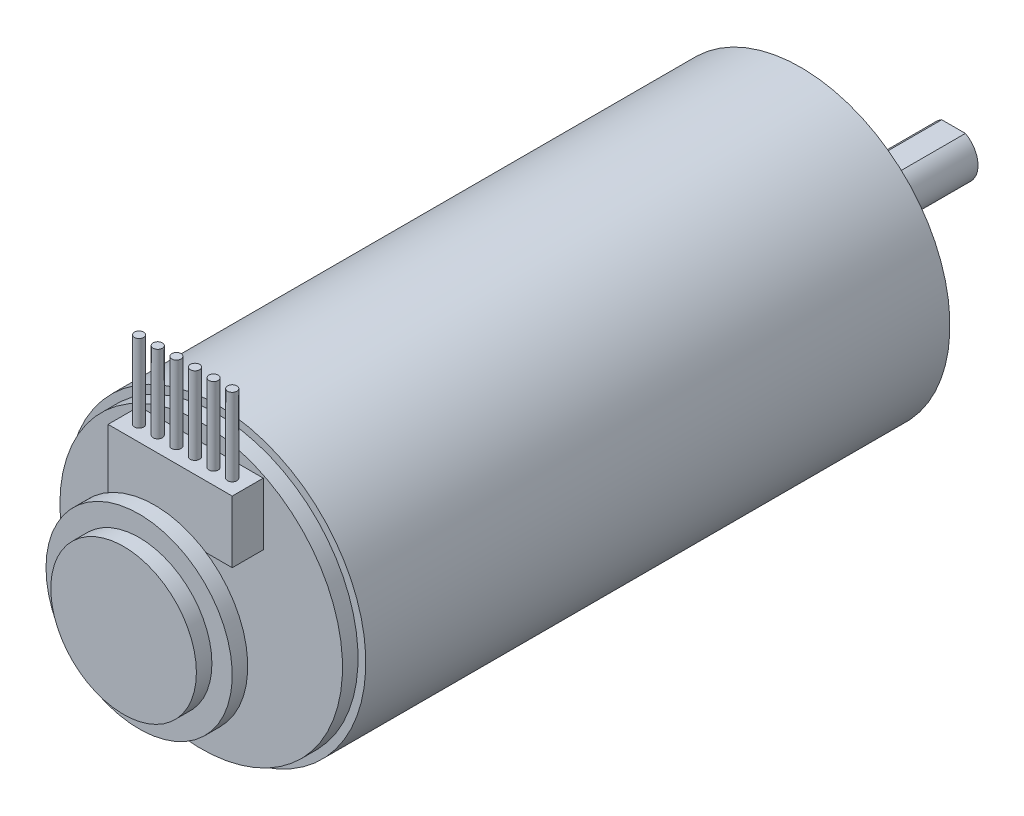
ISO-10303-21;
HEADER;
FILE_DESCRIPTION(('STEP AP214'),'2;1');
FILE_NAME('part.step','',(''),(''),'','','');
FILE_SCHEMA(('AUTOMOTIVE_DESIGN { 1 0 10303 214 1 1 1 1 }'));
ENDSEC;
DATA;
#1=APPLICATION_CONTEXT('core data for automotive mechanical design processes');
#2=APPLICATION_PROTOCOL_DEFINITION('international standard','automotive_design',2000,#1);
#3=PRODUCT_CONTEXT('',#1,'mechanical');
#4=PRODUCT('Part','Part','',(#3));
#5=PRODUCT_RELATED_PRODUCT_CATEGORY('part','',(#4));
#6=PRODUCT_DEFINITION_FORMATION('','',#4);
#7=PRODUCT_DEFINITION_CONTEXT('part definition',#1,'design');
#8=PRODUCT_DEFINITION('design','',#6,#7);
#9=PRODUCT_DEFINITION_SHAPE('','',#8);
#10=(LENGTH_UNIT() NAMED_UNIT(*) SI_UNIT(.MILLI.,.METRE.));
#11=(NAMED_UNIT(*) PLANE_ANGLE_UNIT() SI_UNIT($,.RADIAN.));
#12=(NAMED_UNIT(*) SI_UNIT($,.STERADIAN.) SOLID_ANGLE_UNIT());
#13=UNCERTAINTY_MEASURE_WITH_UNIT(LENGTH_MEASURE(1.E-05),#10,'distance_accuracy_value','');
#14=(GEOMETRIC_REPRESENTATION_CONTEXT(3) GLOBAL_UNCERTAINTY_ASSIGNED_CONTEXT((#13)) GLOBAL_UNIT_ASSIGNED_CONTEXT((#10,
#11,#12)) REPRESENTATION_CONTEXT('',''));
#15=CARTESIAN_POINT('',(0.,0.,0.));
#16=DIRECTION('',(0.,0.,1.));
#17=DIRECTION('',(1.,0.,0.));
#18=AXIS2_PLACEMENT_3D('',#15,#16,#17);
#19=CARTESIAN_POINT('',(11.5650000094,0.,61.5699999992));
#20=DIRECTION('',(0.,0.,1.));
#21=DIRECTION('',(1.,0.,0.));
#22=AXIS2_PLACEMENT_3D('',#19,#20,#21);
#23=PLANE('',#22);
#24=CARTESIAN_POINT('',(0.,0.,61.5699999992));
#25=DIRECTION('',(0.,0.,-1.));
#26=DIRECTION('',(-1.,0.,0.));
#27=AXIS2_PLACEMENT_3D('',#24,#25,#26);
#28=CIRCLE('',#27,1.27);
#29=CARTESIAN_POINT('',(-1.27,0.,61.5699999992));
#30=VERTEX_POINT('',#29);
#31=EDGE_CURVE('E151',#30,#30,#28,.T.);
#32=ORIENTED_EDGE('',*,*,#31,.T.);
#33=EDGE_LOOP('',(#32));
#34=FACE_BOUND('',#33,.T.);
#35=CARTESIAN_POINT('',(0.,0.,61.5699999992));
#36=DIRECTION('',(0.,0.,-1.));
#37=DIRECTION('',(-1.,0.,0.));
#38=AXIS2_PLACEMENT_3D('',#35,#36,#37);
#39=CIRCLE('',#38,11.5650000094);
#40=CARTESIAN_POINT('',(-11.5650000094,0.,61.5699999992));
#41=VERTEX_POINT('',#40);
#42=EDGE_CURVE('E154',#41,#41,#39,.T.);
#43=ORIENTED_EDGE('',*,*,#42,.F.);
#44=EDGE_LOOP('',(#43));
#45=FACE_BOUND('',#44,.T.);
#46=DIRECTION('',(-1.,0.,0.));
#47=VECTOR('',#46,1.);
#48=CARTESIAN_POINT('',(-5.08000000144073,10.1599999970296,61.5699999992));
#49=LINE('',#48,#47);
#50=CARTESIAN_POINT('',(5.08000000144073,10.1599999970296,61.5699999992));
#51=VERTEX_POINT('',#50);
#52=CARTESIAN_POINT('',(-5.08000000144073,10.1599999970296,61.5699999992));
#53=VERTEX_POINT('',#52);
#54=EDGE_CURVE('E494',#51,#53,#49,.T.);
#55=ORIENTED_EDGE('',*,*,#54,.F.);
#56=DIRECTION('',(0.,1.,0.));
#57=VECTOR('',#56,1.);
#58=CARTESIAN_POINT('',(5.08000000144073,10.1599999970296,61.5699999992));
#59=LINE('',#58,#57);
#60=CARTESIAN_POINT('',(5.08000000144073,5.08000000144073,61.5699999992));
#61=VERTEX_POINT('',#60);
#62=EDGE_CURVE('E110',#61,#51,#59,.T.);
#63=ORIENTED_EDGE('',*,*,#62,.F.);
#64=DIRECTION('',(1.,0.,0.));
#65=VECTOR('',#64,1.);
#66=CARTESIAN_POINT('',(5.08000000144073,5.08000000144073,61.5699999992));
#67=LINE('',#66,#65);
#68=CARTESIAN_POINT('',(-5.08000000144073,5.08000000144073,61.5699999992));
#69=VERTEX_POINT('',#68);
#70=EDGE_CURVE('E106',#69,#61,#67,.T.);
#71=ORIENTED_EDGE('',*,*,#70,.F.);
#72=DIRECTION('',(0.,-1.,0.));
#73=VECTOR('',#72,1.);
#74=CARTESIAN_POINT('',(-5.08000000144073,5.08000000144073,61.5699999992));
#75=LINE('',#74,#73);
#76=EDGE_CURVE('E496',#53,#69,#75,.T.);
#77=ORIENTED_EDGE('',*,*,#76,.F.);
#78=EDGE_LOOP('',(#55,#63,#71,#77));
#79=FACE_BOUND('',#78,.T.);
#80=ADVANCED_FACE('F33',(#34,#45,#79),#23,.T.);
#81=CARTESIAN_POINT('',(0.,0.,66.6499999992));
#82=DIRECTION('',(0.,0.,-1.));
#83=DIRECTION('',(-1.,0.,0.));
#84=AXIS2_PLACEMENT_3D('',#81,#82,#83);
#85=CYLINDRICAL_SURFACE('',#84,7.62);
#86=CARTESIAN_POINT('',(0.,0.,66.6499999992));
#87=DIRECTION('',(0.,0.,-1.));
#88=DIRECTION('',(-1.,0.,0.));
#89=AXIS2_PLACEMENT_3D('',#86,#87,#88);
#90=CIRCLE('',#89,7.62);
#91=CARTESIAN_POINT('',(-7.62,0.,66.6499999992));
#92=VERTEX_POINT('',#91);
#93=EDGE_CURVE('E166',#92,#92,#90,.T.);
#94=ORIENTED_EDGE('',*,*,#93,.T.);
#95=EDGE_LOOP('',(#94));
#96=FACE_BOUND('',#95,.T.);
#97=CARTESIAN_POINT('',(0.,0.,65.3799999992));
#98=DIRECTION('',(0.,0.,-1.));
#99=DIRECTION('',(-1.,0.,0.));
#100=AXIS2_PLACEMENT_3D('',#97,#98,#99);
#101=CIRCLE('',#100,7.62);
#102=CARTESIAN_POINT('',(-7.62,0.,65.3799999992));
#103=VERTEX_POINT('',#102);
#104=EDGE_CURVE('E143',#103,#103,#101,.T.);
#105=ORIENTED_EDGE('',*,*,#104,.F.);
#106=EDGE_LOOP('',(#105));
#107=FACE_BOUND('',#106,.T.);
#108=ADVANCED_FACE('F35',(#96,#107),#85,.T.);
#109=CARTESIAN_POINT('',(7.62,0.,66.6499999992));
#110=DIRECTION('',(0.,0.,1.));
#111=DIRECTION('',(1.,0.,0.));
#112=AXIS2_PLACEMENT_3D('',#109,#110,#111);
#113=PLANE('',#112);
#114=CARTESIAN_POINT('',(0.,0.,66.6499999992));
#115=DIRECTION('',(0.,0.,1.));
#116=DIRECTION('',(1.,0.,0.));
#117=AXIS2_PLACEMENT_3D('',#114,#115,#116);
#118=CIRCLE('',#117,5.9577109446);
#119=CARTESIAN_POINT('',(5.9577109446,0.,66.6499999992));
#120=VERTEX_POINT('',#119);
#121=EDGE_CURVE('E112',#120,#120,#118,.T.);
#122=ORIENTED_EDGE('',*,*,#121,.F.);
#123=EDGE_LOOP('',(#122));
#124=FACE_BOUND('',#123,.T.);
#125=ORIENTED_EDGE('',*,*,#93,.F.);
#126=EDGE_LOOP('',(#125));
#127=FACE_BOUND('',#126,.T.);
#128=ADVANCED_FACE('F219',(#124,#127),#113,.T.);
#129=CARTESIAN_POINT('',(0.,0.,12.4999999936));
#130=DIRECTION('',(0.,0.,-1.));
#131=DIRECTION('',(-1.,0.,0.));
#132=AXIS2_PLACEMENT_3D('',#129,#130,#131);
#133=PLANE('',#132);
#134=CARTESIAN_POINT('',(0.,0.,12.4999999936));
#135=DIRECTION('',(0.,0.,-1.));
#136=DIRECTION('',(-1.,0.,0.));
#137=AXIS2_PLACEMENT_3D('',#134,#135,#136);
#138=CIRCLE('',#137,3.5000000104);
#139=CARTESIAN_POINT('',(-3.5000000104,0.,12.4999999936));
#140=VERTEX_POINT('',#139);
#141=EDGE_CURVE('E137',#140,#140,#138,.T.);
#142=ORIENTED_EDGE('',*,*,#141,.F.);
#143=EDGE_LOOP('',(#142));
#144=FACE_BOUND('',#143,.T.);
#145=CARTESIAN_POINT('',(0.,0.,12.4999999936));
#146=DIRECTION('',(0.,0.,-1.));
#147=DIRECTION('',(-1.,0.,0.));
#148=AXIS2_PLACEMENT_3D('',#145,#146,#147);
#149=CIRCLE('',#148,12.2000000094);
#150=CARTESIAN_POINT('',(-12.2000000094,0.,12.4999999936));
#151=VERTEX_POINT('',#150);
#152=EDGE_CURVE('E163',#151,#151,#149,.T.);
#153=ORIENTED_EDGE('',*,*,#152,.T.);
#154=EDGE_LOOP('',(#153));
#155=FACE_BOUND('',#154,.T.);
#156=ADVANCED_FACE('F237',(#144,#155),#133,.T.);
#157=CARTESIAN_POINT('',(0.,0.,66.6499999992));
#158=DIRECTION('',(0.,0.,-1.));
#159=DIRECTION('',(-1.,0.,0.));
#160=AXIS2_PLACEMENT_3D('',#157,#158,#159);
#161=CYLINDRICAL_SURFACE('',#160,12.2000000094);
#162=CARTESIAN_POINT('',(0.,0.,60.2999999992));
#163=DIRECTION('',(0.,0.,-1.));
#164=DIRECTION('',(-1.,0.,0.));
#165=AXIS2_PLACEMENT_3D('',#162,#163,#164);
#166=CIRCLE('',#165,12.2000000094);
#167=CARTESIAN_POINT('',(-12.2000000094,0.,60.2999999992));
#168=VERTEX_POINT('',#167);
#169=EDGE_CURVE('E160',#168,#168,#166,.T.);
#170=ORIENTED_EDGE('',*,*,#169,.T.);
#171=EDGE_LOOP('',(#170));
#172=FACE_BOUND('',#171,.T.);
#173=ORIENTED_EDGE('',*,*,#152,.F.);
#174=EDGE_LOOP('',(#173));
#175=FACE_BOUND('',#174,.T.);
#176=ADVANCED_FACE('F233',(#172,#175),#161,.T.);
#177=CARTESIAN_POINT('',(12.2000000094,0.,60.2999999992));
#178=DIRECTION('',(0.,0.,1.));
#179=DIRECTION('',(1.,0.,0.));
#180=AXIS2_PLACEMENT_3D('',#177,#178,#179);
#181=PLANE('',#180);
#182=CARTESIAN_POINT('',(0.,0.,60.2999999992));
#183=DIRECTION('',(0.,0.,-1.));
#184=DIRECTION('',(-1.,0.,0.));
#185=AXIS2_PLACEMENT_3D('',#182,#183,#184);
#186=CIRCLE('',#185,11.5650000094);
#187=CARTESIAN_POINT('',(-11.5650000094,0.,60.2999999992));
#188=VERTEX_POINT('',#187);
#189=EDGE_CURVE('E157',#188,#188,#186,.T.);
#190=ORIENTED_EDGE('',*,*,#189,.T.);
#191=EDGE_LOOP('',(#190));
#192=FACE_BOUND('',#191,.T.);
#193=ORIENTED_EDGE('',*,*,#169,.F.);
#194=EDGE_LOOP('',(#193));
#195=FACE_BOUND('',#194,.T.);
#196=ADVANCED_FACE('F229',(#192,#195),#181,.T.);
#197=CARTESIAN_POINT('',(0.,0.,66.6499999992));
#198=DIRECTION('',(0.,0.,-1.));
#199=DIRECTION('',(-1.,0.,0.));
#200=AXIS2_PLACEMENT_3D('',#197,#198,#199);
#201=CYLINDRICAL_SURFACE('',#200,11.5650000094);
#202=ORIENTED_EDGE('',*,*,#42,.T.);
#203=EDGE_LOOP('',(#202));
#204=FACE_BOUND('',#203,.T.);
#205=ORIENTED_EDGE('',*,*,#189,.F.);
#206=EDGE_LOOP('',(#205));
#207=FACE_BOUND('',#206,.T.);
#208=ADVANCED_FACE('F226',(#204,#207),#201,.T.);
#209=CARTESIAN_POINT('',(0.,0.,66.6499999992));
#210=DIRECTION('',(0.,0.,-1.));
#211=DIRECTION('',(-1.,0.,0.));
#212=AXIS2_PLACEMENT_3D('',#209,#210,#211);
#213=CYLINDRICAL_SURFACE('',#212,1.27);
#214=CARTESIAN_POINT('',(0.,0.,65.3799999992));
#215=DIRECTION('',(0.,0.,-1.));
#216=DIRECTION('',(-1.,0.,0.));
#217=AXIS2_PLACEMENT_3D('',#214,#215,#216);
#218=CIRCLE('',#217,1.27);
#219=CARTESIAN_POINT('',(-1.27,0.,65.3799999992));
#220=VERTEX_POINT('',#219);
#221=EDGE_CURVE('E148',#220,#220,#218,.T.);
#222=ORIENTED_EDGE('',*,*,#221,.T.);
#223=EDGE_LOOP('',(#222));
#224=FACE_BOUND('',#223,.T.);
#225=ORIENTED_EDGE('',*,*,#31,.F.);
#226=EDGE_LOOP('',(#225));
#227=FACE_BOUND('',#226,.T.);
#228=ADVANCED_FACE('F224',(#224,#227),#213,.T.);
#229=CARTESIAN_POINT('',(1.27,0.,65.3799999992));
#230=DIRECTION('',(0.,0.,-1.));
#231=DIRECTION('',(-1.,0.,0.));
#232=AXIS2_PLACEMENT_3D('',#229,#230,#231);
#233=PLANE('',#232);
#234=ORIENTED_EDGE('',*,*,#104,.T.);
#235=EDGE_LOOP('',(#234));
#236=FACE_BOUND('',#235,.T.);
#237=ORIENTED_EDGE('',*,*,#221,.F.);
#238=EDGE_LOOP('',(#237));
#239=FACE_BOUND('',#238,.T.);
#240=ADVANCED_FACE('F251',(#236,#239),#233,.T.);
#241=CARTESIAN_POINT('',(0.,0.,9.9999999898));
#242=DIRECTION('',(0.,0.,1.));
#243=DIRECTION('',(1.,0.,0.));
#244=AXIS2_PLACEMENT_3D('',#241,#242,#243);
#245=CYLINDRICAL_SURFACE('',#244,3.5000000104);
#246=CARTESIAN_POINT('',(0.,0.,9.9999999898));
#247=DIRECTION('',(0.,0.,-1.));
#248=DIRECTION('',(-1.,0.,0.));
#249=AXIS2_PLACEMENT_3D('',#246,#247,#248);
#250=CIRCLE('',#249,3.5000000104);
#251=CARTESIAN_POINT('',(-3.5000000104,0.,9.9999999898));
#252=VERTEX_POINT('',#251);
#253=EDGE_CURVE('E140',#252,#252,#250,.T.);
#254=ORIENTED_EDGE('',*,*,#253,.F.);
#255=EDGE_LOOP('',(#254));
#256=FACE_BOUND('',#255,.T.);
#257=ORIENTED_EDGE('',*,*,#141,.T.);
#258=EDGE_LOOP('',(#257));
#259=FACE_BOUND('',#258,.T.);
#260=ADVANCED_FACE('F254',(#256,#259),#245,.T.);
#261=CARTESIAN_POINT('',(0.,0.,9.9999999898));
#262=DIRECTION('',(0.,0.,-1.));
#263=DIRECTION('',(-1.,0.,0.));
#264=AXIS2_PLACEMENT_3D('',#261,#262,#263);
#265=PLANE('',#264);
#266=CARTESIAN_POINT('',(0.,0.,9.9999999898));
#267=DIRECTION('',(0.,0.,-1.));
#268=DIRECTION('',(-1.,0.,0.));
#269=AXIS2_PLACEMENT_3D('',#266,#267,#268);
#270=CIRCLE('',#269,1.9999999878);
#271=CARTESIAN_POINT('',(-1.9999999878,0.,9.9999999898));
#272=VERTEX_POINT('',#271);
#273=EDGE_CURVE('E132',#272,#272,#270,.T.);
#274=ORIENTED_EDGE('',*,*,#273,.F.);
#275=EDGE_LOOP('',(#274));
#276=FACE_BOUND('',#275,.T.);
#277=ORIENTED_EDGE('',*,*,#253,.T.);
#278=EDGE_LOOP('',(#277));
#279=FACE_BOUND('',#278,.T.);
#280=ADVANCED_FACE('F275',(#276,#279),#265,.T.);
#281=CARTESIAN_POINT('',(0.,0.,0.));
#282=DIRECTION('',(0.,0.,1.));
#283=DIRECTION('',(1.,0.,0.));
#284=AXIS2_PLACEMENT_3D('',#281,#282,#283);
#285=CYLINDRICAL_SURFACE('',#284,1.9999999878);
#286=CARTESIAN_POINT('',(0.,0.,0.));
#287=DIRECTION('',(0.,0.,-1.));
#288=DIRECTION('',(-1.,0.,0.));
#289=AXIS2_PLACEMENT_3D('',#286,#287,#288);
#290=CIRCLE('',#289,1.9999999878);
#291=CARTESIAN_POINT('',(0.968245816230207,1.74999999730077,0.));
#292=VERTEX_POINT('',#291);
#293=CARTESIAN_POINT('',(-0.968245815871272,1.74999999730077,0.));
#294=VERTEX_POINT('',#293);
#295=EDGE_CURVE('E134',#292,#294,#290,.T.);
#296=ORIENTED_EDGE('',*,*,#295,.F.);
#297=DIRECTION('',(0.,0.,-1.));
#298=VECTOR('',#297,1.);
#299=CARTESIAN_POINT('',(0.968245816230203,1.74999999730077,8.000000002));
#300=LINE('',#299,#298);
#301=CARTESIAN_POINT('',(0.968245816230203,1.74999999730077,8.000000002));
#302=VERTEX_POINT('',#301);
#303=EDGE_CURVE('E56',#302,#292,#300,.T.);
#304=ORIENTED_EDGE('',*,*,#303,.F.);
#305=CARTESIAN_POINT('',(1.79465220895986E-10,-9.92992580522989E-11,8.000000002));
#306=DIRECTION('',(0.,0.,-1.));
#307=DIRECTION('',(-1.,0.,0.));
#308=AXIS2_PLACEMENT_3D('',#305,#306,#307);
#309=CIRCLE('',#308,1.9999999878);
#310=CARTESIAN_POINT('',(-0.968245815871272,1.74999999730077,8.000000002));
#311=VERTEX_POINT('',#310);
#312=EDGE_CURVE('E123',#311,#302,#309,.T.);
#313=ORIENTED_EDGE('',*,*,#312,.F.);
#314=DIRECTION('',(0.,0.,-1.));
#315=VECTOR('',#314,1.);
#316=CARTESIAN_POINT('',(-0.968245815871272,1.74999999730077,8.000000002));
#317=LINE('',#316,#315);
#318=EDGE_CURVE('E129',#311,#294,#317,.T.);
#319=ORIENTED_EDGE('',*,*,#318,.T.);
#320=EDGE_LOOP('',(#296,#304,#313,#319));
#321=FACE_BOUND('',#320,.T.);
#322=ORIENTED_EDGE('',*,*,#273,.T.);
#323=EDGE_LOOP('',(#322));
#324=FACE_BOUND('',#323,.T.);
#325=ADVANCED_FACE('F283',(#321,#324),#285,.T.);
#326=CARTESIAN_POINT('',(0.,0.,0.));
#327=DIRECTION('',(0.,0.,-1.));
#328=DIRECTION('',(-1.,0.,0.));
#329=AXIS2_PLACEMENT_3D('',#326,#327,#328);
#330=PLANE('',#329);
#331=DIRECTION('',(-1.,0.,0.));
#332=VECTOR('',#331,1.);
#333=CARTESIAN_POINT('',(0.968245816230203,1.74999999730077,0.));
#334=LINE('',#333,#332);
#335=EDGE_CURVE('E121',#292,#294,#334,.T.);
#336=ORIENTED_EDGE('',*,*,#335,.F.);
#337=ORIENTED_EDGE('',*,*,#295,.T.);
#338=EDGE_LOOP('',(#336,#337));
#339=FACE_BOUND('',#338,.T.);
#340=ADVANCED_FACE('F291',(#339),#330,.T.);
#341=CARTESIAN_POINT('',(0.968245816230203,1.74999999730077,8.000000002));
#342=DIRECTION('',(0.,-1.,0.));
#343=DIRECTION('',(0.,0.,-1.));
#344=AXIS2_PLACEMENT_3D('',#341,#342,#343);
#345=PLANE('',#344);
#346=ORIENTED_EDGE('',*,*,#335,.T.);
#347=ORIENTED_EDGE('',*,*,#318,.F.);
#348=DIRECTION('',(-1.,0.,0.));
#349=VECTOR('',#348,1.);
#350=CARTESIAN_POINT('',(0.968245816230203,1.74999999730077,8.000000002));
#351=LINE('',#350,#349);
#352=EDGE_CURVE('E125',#302,#311,#351,.T.);
#353=ORIENTED_EDGE('',*,*,#352,.F.);
#354=ORIENTED_EDGE('',*,*,#303,.T.);
#355=EDGE_LOOP('',(#346,#347,#353,#354));
#356=FACE_BOUND('',#355,.T.);
#357=ADVANCED_FACE('F299',(#356),#345,.F.);
#358=CARTESIAN_POINT('',(1.79465220895986E-10,-9.92992580522989E-11,8.000000002));
#359=DIRECTION('',(0.,0.,-1.));
#360=DIRECTION('',(-1.,0.,0.));
#361=AXIS2_PLACEMENT_3D('',#358,#359,#360);
#362=PLANE('',#361);
#363=ORIENTED_EDGE('',*,*,#312,.T.);
#364=ORIENTED_EDGE('',*,*,#352,.T.);
#365=EDGE_LOOP('',(#363,#364));
#366=FACE_BOUND('',#365,.T.);
#367=ADVANCED_FACE('F307',(#366),#362,.T.);
#368=CARTESIAN_POINT('',(0.,0.,67.9199999992));
#369=DIRECTION('',(0.,0.,-1.));
#370=DIRECTION('',(-1.,0.,0.));
#371=AXIS2_PLACEMENT_3D('',#368,#369,#370);
#372=CYLINDRICAL_SURFACE('',#371,5.9577109446);
#373=CARTESIAN_POINT('',(0.,0.,67.9199999992));
#374=DIRECTION('',(0.,0.,1.));
#375=DIRECTION('',(1.,0.,0.));
#376=AXIS2_PLACEMENT_3D('',#373,#374,#375);
#377=CIRCLE('',#376,5.9577109446);
#378=CARTESIAN_POINT('',(5.9577109446,0.,67.9199999992));
#379=VERTEX_POINT('',#378);
#380=EDGE_CURVE('E115',#379,#379,#377,.T.);
#381=ORIENTED_EDGE('',*,*,#380,.F.);
#382=EDGE_LOOP('',(#381));
#383=FACE_BOUND('',#382,.T.);
#384=ORIENTED_EDGE('',*,*,#121,.T.);
#385=EDGE_LOOP('',(#384));
#386=FACE_BOUND('',#385,.T.);
#387=ADVANCED_FACE('F314',(#383,#386),#372,.T.);
#388=CARTESIAN_POINT('',(0.,0.,67.9199999992));
#389=DIRECTION('',(0.,0.,1.));
#390=DIRECTION('',(1.,0.,0.));
#391=AXIS2_PLACEMENT_3D('',#388,#389,#390);
#392=PLANE('',#391);
#393=ORIENTED_EDGE('',*,*,#380,.T.);
#394=EDGE_LOOP('',(#393));
#395=FACE_BOUND('',#394,.T.);
#396=ADVANCED_FACE('F322',(#395),#392,.T.);
#397=CARTESIAN_POINT('',(5.08000000144073,10.1599999970296,64.1099999992));
#398=DIRECTION('',(-1.,0.,0.));
#399=DIRECTION('',(0.,0.,1.));
#400=AXIS2_PLACEMENT_3D('',#397,#398,#399);
#401=PLANE('',#400);
#402=ORIENTED_EDGE('',*,*,#62,.T.);
#403=DIRECTION('',(0.,0.,-1.));
#404=VECTOR('',#403,1.);
#405=CARTESIAN_POINT('',(5.08000000144073,10.1599999970296,64.1099999992));
#406=LINE('',#405,#404);
#407=CARTESIAN_POINT('',(5.08000000144073,10.1599999970296,64.1099999992));
#408=VERTEX_POINT('',#407);
#409=EDGE_CURVE('E91',#408,#51,#406,.T.);
#410=ORIENTED_EDGE('',*,*,#409,.F.);
#411=DIRECTION('',(0.,1.,0.));
#412=VECTOR('',#411,1.);
#413=CARTESIAN_POINT('',(5.08000000144073,10.1599999970296,64.1099999992));
#414=LINE('',#413,#412);
#415=CARTESIAN_POINT('',(5.08000000144073,5.08000000144073,64.1099999992));
#416=VERTEX_POINT('',#415);
#417=EDGE_CURVE('E98',#416,#408,#414,.T.);
#418=ORIENTED_EDGE('',*,*,#417,.F.);
#419=DIRECTION('',(0.,0.,-1.));
#420=VECTOR('',#419,1.);
#421=CARTESIAN_POINT('',(5.08000000144073,5.08000000144073,64.1099999992));
#422=LINE('',#421,#420);
#423=EDGE_CURVE('E492',#416,#61,#422,.T.);
#424=ORIENTED_EDGE('',*,*,#423,.T.);
#425=EDGE_LOOP('',(#402,#410,#418,#424));
#426=FACE_BOUND('',#425,.T.);
#427=ADVANCED_FACE('F108',(#426),#401,.F.);
#428=CARTESIAN_POINT('',(-5.08000000144073,10.1599999970296,64.1099999992));
#429=DIRECTION('',(0.,-1.,0.));
#430=DIRECTION('',(0.,0.,-1.));
#431=AXIS2_PLACEMENT_3D('',#428,#429,#430);
#432=PLANE('',#431);
#433=CARTESIAN_POINT('',(3.81,10.1599999970296,62.8399999992));
#434=DIRECTION('',(0.,-1.,0.));
#435=DIRECTION('',(0.,0.,-1.));
#436=AXIS2_PLACEMENT_3D('',#433,#434,#435);
#437=CIRCLE('',#436,0.380999999999999);
#438=CARTESIAN_POINT('',(3.81,10.1599999970296,62.4589999992));
#439=VERTEX_POINT('',#438);
#440=EDGE_CURVE('E11',#439,#439,#437,.F.);
#441=ORIENTED_EDGE('',*,*,#440,.F.);
#442=EDGE_LOOP('',(#441));
#443=FACE_BOUND('',#442,.T.);
#444=CARTESIAN_POINT('',(0.762,10.1599999970296,62.8399999992));
#445=DIRECTION('',(0.,-1.,0.));
#446=DIRECTION('',(0.,0.,-1.));
#447=AXIS2_PLACEMENT_3D('',#444,#445,#446);
#448=CIRCLE('',#447,0.380999999999999);
#449=CARTESIAN_POINT('',(0.762,10.1599999970296,62.4589999992));
#450=VERTEX_POINT('',#449);
#451=EDGE_CURVE('E41',#450,#450,#448,.F.);
#452=ORIENTED_EDGE('',*,*,#451,.F.);
#453=EDGE_LOOP('',(#452));
#454=FACE_BOUND('',#453,.T.);
#455=CARTESIAN_POINT('',(-2.286,10.1599999970296,62.8399999992));
#456=DIRECTION('',(0.,-1.,0.));
#457=DIRECTION('',(0.,0.,-1.));
#458=AXIS2_PLACEMENT_3D('',#455,#456,#457);
#459=CIRCLE('',#458,0.380999999999999);
#460=CARTESIAN_POINT('',(-2.286,10.1599999970296,62.4589999992));
#461=VERTEX_POINT('',#460);
#462=EDGE_CURVE('E178',#461,#461,#459,.F.);
#463=ORIENTED_EDGE('',*,*,#462,.F.);
#464=EDGE_LOOP('',(#463));
#465=FACE_BOUND('',#464,.T.);
#466=CARTESIAN_POINT('',(-0.762,10.1599999970296,62.8399999992));
#467=DIRECTION('',(0.,-1.,0.));
#468=DIRECTION('',(0.,0.,-1.));
#469=AXIS2_PLACEMENT_3D('',#466,#467,#468);
#470=CIRCLE('',#469,0.380999999999999);
#471=CARTESIAN_POINT('',(-0.762,10.1599999970296,62.4589999992));
#472=VERTEX_POINT('',#471);
#473=EDGE_CURVE('E175',#472,#472,#470,.F.);
#474=ORIENTED_EDGE('',*,*,#473,.F.);
#475=EDGE_LOOP('',(#474));
#476=FACE_BOUND('',#475,.T.);
#477=CARTESIAN_POINT('',(-3.81,10.1599999970296,62.8399999992));
#478=DIRECTION('',(0.,-1.,0.));
#479=DIRECTION('',(0.,0.,-1.));
#480=AXIS2_PLACEMENT_3D('',#477,#478,#479);
#481=CIRCLE('',#480,0.380999999999999);
#482=CARTESIAN_POINT('',(-3.81,10.1599999970296,62.4589999992));
#483=VERTEX_POINT('',#482);
#484=EDGE_CURVE('E172',#483,#483,#481,.F.);
#485=ORIENTED_EDGE('',*,*,#484,.F.);
#486=EDGE_LOOP('',(#485));
#487=FACE_BOUND('',#486,.T.);
#488=CARTESIAN_POINT('',(2.286,10.1599999970296,62.8399999992));
#489=DIRECTION('',(0.,-1.,0.));
#490=DIRECTION('',(0.,0.,-1.));
#491=AXIS2_PLACEMENT_3D('',#488,#489,#490);
#492=CIRCLE('',#491,0.380999999999999);
#493=CARTESIAN_POINT('',(2.286,10.1599999970296,62.4589999992));
#494=VERTEX_POINT('',#493);
#495=EDGE_CURVE('E169',#494,#494,#492,.F.);
#496=ORIENTED_EDGE('',*,*,#495,.F.);
#497=EDGE_LOOP('',(#496));
#498=FACE_BOUND('',#497,.T.);
#499=ORIENTED_EDGE('',*,*,#54,.T.);
#500=DIRECTION('',(0.,0.,-1.));
#501=VECTOR('',#500,1.);
#502=CARTESIAN_POINT('',(-5.08000000144073,10.1599999970296,64.1099999992));
#503=LINE('',#502,#501);
#504=CARTESIAN_POINT('',(-5.08000000144073,10.1599999970296,64.1099999992));
#505=VERTEX_POINT('',#504);
#506=EDGE_CURVE('E94',#505,#53,#503,.T.);
#507=ORIENTED_EDGE('',*,*,#506,.F.);
#508=DIRECTION('',(-1.,0.,0.));
#509=VECTOR('',#508,1.);
#510=CARTESIAN_POINT('',(-5.08000000144073,10.1599999970296,64.1099999992));
#511=LINE('',#510,#509);
#512=EDGE_CURVE('E87',#408,#505,#511,.T.);
#513=ORIENTED_EDGE('',*,*,#512,.F.);
#514=ORIENTED_EDGE('',*,*,#409,.T.);
#515=EDGE_LOOP('',(#499,#507,#513,#514));
#516=FACE_BOUND('',#515,.T.);
#517=ADVANCED_FACE('F89',(#443,#454,#465,#476,#487,#498,#516),#432,.F.);
#518=CARTESIAN_POINT('',(-5.08000000144073,5.08000000144073,64.1099999992));
#519=DIRECTION('',(1.,0.,0.));
#520=DIRECTION('',(0.,0.,-1.));
#521=AXIS2_PLACEMENT_3D('',#518,#519,#520);
#522=PLANE('',#521);
#523=ORIENTED_EDGE('',*,*,#76,.T.);
#524=DIRECTION('',(0.,0.,-1.));
#525=VECTOR('',#524,1.);
#526=CARTESIAN_POINT('',(-5.08000000144073,5.08000000144073,64.1099999992));
#527=LINE('',#526,#525);
#528=CARTESIAN_POINT('',(-5.08000000144073,5.08000000144073,64.1099999992));
#529=VERTEX_POINT('',#528);
#530=EDGE_CURVE('E48',#529,#69,#527,.T.);
#531=ORIENTED_EDGE('',*,*,#530,.F.);
#532=DIRECTION('',(0.,-1.,0.));
#533=VECTOR('',#532,1.);
#534=CARTESIAN_POINT('',(-5.08000000144073,5.08000000144073,64.1099999992));
#535=LINE('',#534,#533);
#536=EDGE_CURVE('E97',#505,#529,#535,.T.);
#537=ORIENTED_EDGE('',*,*,#536,.F.);
#538=ORIENTED_EDGE('',*,*,#506,.T.);
#539=EDGE_LOOP('',(#523,#531,#537,#538));
#540=FACE_BOUND('',#539,.T.);
#541=ADVANCED_FACE('F187',(#540),#522,.F.);
#542=CARTESIAN_POINT('',(5.08000000144073,5.08000000144073,64.1099999992));
#543=DIRECTION('',(0.,1.,0.));
#544=DIRECTION('',(0.,0.,1.));
#545=AXIS2_PLACEMENT_3D('',#542,#543,#544);
#546=PLANE('',#545);
#547=ORIENTED_EDGE('',*,*,#70,.T.);
#548=ORIENTED_EDGE('',*,*,#423,.F.);
#549=DIRECTION('',(1.,0.,0.));
#550=VECTOR('',#549,1.);
#551=CARTESIAN_POINT('',(5.08000000144073,5.08000000144073,64.1099999992));
#552=LINE('',#551,#550);
#553=EDGE_CURVE('E102',#529,#416,#552,.T.);
#554=ORIENTED_EDGE('',*,*,#553,.F.);
#555=ORIENTED_EDGE('',*,*,#530,.T.);
#556=EDGE_LOOP('',(#547,#548,#554,#555));
#557=FACE_BOUND('',#556,.T.);
#558=ADVANCED_FACE('F210',(#557),#546,.F.);
#559=CARTESIAN_POINT('',(0.,0.,64.1099999992));
#560=DIRECTION('',(0.,0.,-1.));
#561=DIRECTION('',(-1.,0.,0.));
#562=AXIS2_PLACEMENT_3D('',#559,#560,#561);
#563=PLANE('',#562);
#564=ORIENTED_EDGE('',*,*,#417,.T.);
#565=ORIENTED_EDGE('',*,*,#512,.T.);
#566=ORIENTED_EDGE('',*,*,#536,.T.);
#567=ORIENTED_EDGE('',*,*,#553,.T.);
#568=EDGE_LOOP('',(#564,#565,#566,#567));
#569=FACE_BOUND('',#568,.T.);
#570=ADVANCED_FACE('F101',(#569),#563,.F.);
#571=CARTESIAN_POINT('',(2.286,16.5099999970296,62.8399999992));
#572=DIRECTION('',(0.,-1.,0.));
#573=DIRECTION('',(0.,0.,-1.));
#574=AXIS2_PLACEMENT_3D('',#571,#572,#573);
#575=CYLINDRICAL_SURFACE('',#574,0.380999999999999);
#576=CARTESIAN_POINT('',(2.286,16.5099999970296,62.8399999992));
#577=DIRECTION('',(0.,1.,0.));
#578=DIRECTION('',(0.,0.,1.));
#579=AXIS2_PLACEMENT_3D('',#576,#577,#578);
#580=CIRCLE('',#579,0.380999999999999);
#581=CARTESIAN_POINT('',(2.286,16.5099999970296,63.2209999992));
#582=VERTEX_POINT('',#581);
#583=EDGE_CURVE('E487',#582,#582,#580,.T.);
#584=ORIENTED_EDGE('',*,*,#583,.F.);
#585=EDGE_LOOP('',(#584));
#586=FACE_BOUND('',#585,.T.);
#587=ORIENTED_EDGE('',*,*,#495,.T.);
#588=EDGE_LOOP('',(#587));
#589=FACE_BOUND('',#588,.T.);
#590=ADVANCED_FACE('F198',(#586,#589),#575,.T.);
#591=CARTESIAN_POINT('',(2.286,16.5099999970296,62.8399999992));
#592=DIRECTION('',(0.,1.,0.));
#593=DIRECTION('',(0.,0.,1.));
#594=AXIS2_PLACEMENT_3D('',#591,#592,#593);
#595=PLANE('',#594);
#596=ORIENTED_EDGE('',*,*,#583,.T.);
#597=EDGE_LOOP('',(#596));
#598=FACE_BOUND('',#597,.T.);
#599=ADVANCED_FACE('F200',(#598),#595,.T.);
#600=CARTESIAN_POINT('',(-3.81,16.5099999970296,62.8399999992));
#601=DIRECTION('',(0.,-1.,0.));
#602=DIRECTION('',(0.,0.,-1.));
#603=AXIS2_PLACEMENT_3D('',#600,#601,#602);
#604=CYLINDRICAL_SURFACE('',#603,0.380999999999999);
#605=CARTESIAN_POINT('',(-3.81,16.5099999970296,62.8399999992));
#606=DIRECTION('',(0.,1.,0.));
#607=DIRECTION('',(0.,0.,1.));
#608=AXIS2_PLACEMENT_3D('',#605,#606,#607);
#609=CIRCLE('',#608,0.380999999999999);
#610=CARTESIAN_POINT('',(-3.81,16.5099999970296,63.2209999992));
#611=VERTEX_POINT('',#610);
#612=EDGE_CURVE('E484',#611,#611,#609,.T.);
#613=ORIENTED_EDGE('',*,*,#612,.F.);
#614=EDGE_LOOP('',(#613));
#615=FACE_BOUND('',#614,.T.);
#616=ORIENTED_EDGE('',*,*,#484,.T.);
#617=EDGE_LOOP('',(#616));
#618=FACE_BOUND('',#617,.T.);
#619=ADVANCED_FACE('F207',(#615,#618),#604,.T.);
#620=CARTESIAN_POINT('',(-3.81,16.5099999970296,62.8399999992));
#621=DIRECTION('',(0.,1.,0.));
#622=DIRECTION('',(0.,0.,1.));
#623=AXIS2_PLACEMENT_3D('',#620,#621,#622);
#624=PLANE('',#623);
#625=ORIENTED_EDGE('',*,*,#612,.T.);
#626=EDGE_LOOP('',(#625));
#627=FACE_BOUND('',#626,.T.);
#628=ADVANCED_FACE('F379',(#627),#624,.T.);
#629=CARTESIAN_POINT('',(-0.762,16.5099999970296,62.8399999992));
#630=DIRECTION('',(0.,-1.,0.));
#631=DIRECTION('',(0.,0.,-1.));
#632=AXIS2_PLACEMENT_3D('',#629,#630,#631);
#633=CYLINDRICAL_SURFACE('',#632,0.380999999999999);
#634=CARTESIAN_POINT('',(-0.762,16.5099999970296,62.8399999992));
#635=DIRECTION('',(0.,1.,0.));
#636=DIRECTION('',(0.,0.,1.));
#637=AXIS2_PLACEMENT_3D('',#634,#635,#636);
#638=CIRCLE('',#637,0.380999999999999);
#639=CARTESIAN_POINT('',(-0.762,16.5099999970296,63.2209999992));
#640=VERTEX_POINT('',#639);
#641=EDGE_CURVE('E481',#640,#640,#638,.T.);
#642=ORIENTED_EDGE('',*,*,#641,.F.);
#643=EDGE_LOOP('',(#642));
#644=FACE_BOUND('',#643,.T.);
#645=ORIENTED_EDGE('',*,*,#473,.T.);
#646=EDGE_LOOP('',(#645));
#647=FACE_BOUND('',#646,.T.);
#648=ADVANCED_FACE('F389',(#644,#647),#633,.T.);
#649=CARTESIAN_POINT('',(-0.762,16.5099999970296,62.8399999992));
#650=DIRECTION('',(0.,1.,0.));
#651=DIRECTION('',(0.,0.,1.));
#652=AXIS2_PLACEMENT_3D('',#649,#650,#651);
#653=PLANE('',#652);
#654=ORIENTED_EDGE('',*,*,#641,.T.);
#655=EDGE_LOOP('',(#654));
#656=FACE_BOUND('',#655,.T.);
#657=ADVANCED_FACE('F399',(#656),#653,.T.);
#658=CARTESIAN_POINT('',(-2.286,16.5099999970296,62.8399999992));
#659=DIRECTION('',(0.,-1.,0.));
#660=DIRECTION('',(0.,0.,-1.));
#661=AXIS2_PLACEMENT_3D('',#658,#659,#660);
#662=CYLINDRICAL_SURFACE('',#661,0.380999999999999);
#663=CARTESIAN_POINT('',(-2.286,16.5099999970296,62.8399999992));
#664=DIRECTION('',(0.,1.,0.));
#665=DIRECTION('',(0.,0.,1.));
#666=AXIS2_PLACEMENT_3D('',#663,#664,#665);
#667=CIRCLE('',#666,0.380999999999999);
#668=CARTESIAN_POINT('',(-2.286,16.5099999970296,63.2209999992));
#669=VERTEX_POINT('',#668);
#670=EDGE_CURVE('E476',#669,#669,#667,.T.);
#671=ORIENTED_EDGE('',*,*,#670,.F.);
#672=EDGE_LOOP('',(#671));
#673=FACE_BOUND('',#672,.T.);
#674=ORIENTED_EDGE('',*,*,#462,.T.);
#675=EDGE_LOOP('',(#674));
#676=FACE_BOUND('',#675,.T.);
#677=ADVANCED_FACE('F409',(#673,#676),#662,.T.);
#678=CARTESIAN_POINT('',(-2.286,16.5099999970296,62.8399999992));
#679=DIRECTION('',(0.,1.,0.));
#680=DIRECTION('',(0.,0.,1.));
#681=AXIS2_PLACEMENT_3D('',#678,#679,#680);
#682=PLANE('',#681);
#683=ORIENTED_EDGE('',*,*,#670,.T.);
#684=EDGE_LOOP('',(#683));
#685=FACE_BOUND('',#684,.T.);
#686=ADVANCED_FACE('F419',(#685),#682,.T.);
#687=CARTESIAN_POINT('',(0.762,16.5099999970296,62.8399999992));
#688=DIRECTION('',(0.,-1.,0.));
#689=DIRECTION('',(0.,0.,-1.));
#690=AXIS2_PLACEMENT_3D('',#687,#688,#689);
#691=CYLINDRICAL_SURFACE('',#690,0.380999999999999);
#692=CARTESIAN_POINT('',(0.762,16.5099999970296,62.8399999992));
#693=DIRECTION('',(0.,1.,0.));
#694=DIRECTION('',(0.,0.,1.));
#695=AXIS2_PLACEMENT_3D('',#692,#693,#694);
#696=CIRCLE('',#695,0.380999999999999);
#697=CARTESIAN_POINT('',(0.762,16.5099999970296,63.2209999992));
#698=VERTEX_POINT('',#697);
#699=EDGE_CURVE('E473',#698,#698,#696,.T.);
#700=ORIENTED_EDGE('',*,*,#699,.F.);
#701=EDGE_LOOP('',(#700));
#702=FACE_BOUND('',#701,.T.);
#703=ORIENTED_EDGE('',*,*,#451,.T.);
#704=EDGE_LOOP('',(#703));
#705=FACE_BOUND('',#704,.T.);
#706=ADVANCED_FACE('F183',(#702,#705),#691,.T.);
#707=CARTESIAN_POINT('',(0.762,16.5099999970296,62.8399999992));
#708=DIRECTION('',(0.,1.,0.));
#709=DIRECTION('',(0.,0.,1.));
#710=AXIS2_PLACEMENT_3D('',#707,#708,#709);
#711=PLANE('',#710);
#712=ORIENTED_EDGE('',*,*,#699,.T.);
#713=EDGE_LOOP('',(#712));
#714=FACE_BOUND('',#713,.T.);
#715=ADVANCED_FACE('F437',(#714),#711,.T.);
#716=CARTESIAN_POINT('',(3.81,16.5099999970296,62.8399999992));
#717=DIRECTION('',(0.,-1.,0.));
#718=DIRECTION('',(0.,0.,-1.));
#719=AXIS2_PLACEMENT_3D('',#716,#717,#718);
#720=CYLINDRICAL_SURFACE('',#719,0.380999999999999);
#721=CARTESIAN_POINT('',(3.81,16.5099999970296,62.8399999992));
#722=DIRECTION('',(0.,1.,0.));
#723=DIRECTION('',(0.,0.,1.));
#724=AXIS2_PLACEMENT_3D('',#721,#722,#723);
#725=CIRCLE('',#724,0.380999999999999);
#726=CARTESIAN_POINT('',(3.81,16.5099999970296,63.2209999992));
#727=VERTEX_POINT('',#726);
#728=EDGE_CURVE('E472',#727,#727,#725,.T.);
#729=ORIENTED_EDGE('',*,*,#728,.F.);
#730=EDGE_LOOP('',(#729));
#731=FACE_BOUND('',#730,.T.);
#732=ORIENTED_EDGE('',*,*,#440,.T.);
#733=EDGE_LOOP('',(#732));
#734=FACE_BOUND('',#733,.T.);
#735=ADVANCED_FACE('F446',(#731,#734),#720,.T.);
#736=CARTESIAN_POINT('',(3.81,16.5099999970296,62.8399999992));
#737=DIRECTION('',(0.,1.,0.));
#738=DIRECTION('',(0.,0.,1.));
#739=AXIS2_PLACEMENT_3D('',#736,#737,#738);
#740=PLANE('',#739);
#741=ORIENTED_EDGE('',*,*,#728,.T.);
#742=EDGE_LOOP('',(#741));
#743=FACE_BOUND('',#742,.T.);
#744=ADVANCED_FACE('F456',(#743),#740,.T.);
#745=CLOSED_SHELL('',(#80,#108,#128,#156,#176,#196,#208,#228,#240,#260,#280,#325,#340,#357,#367,
#387,#396,#427,#517,#541,#558,#570,#590,#599,#619,#628,#648,#657,#677,#686,#706,#715,#735,#744));
#746=MANIFOLD_SOLID_BREP('B2',#745);
#747=ADVANCED_BREP_SHAPE_REPRESENTATION('',(#18,#746),#14);
#748=SHAPE_DEFINITION_REPRESENTATION(#9,#747);
ENDSEC;
END-ISO-10303-21;
